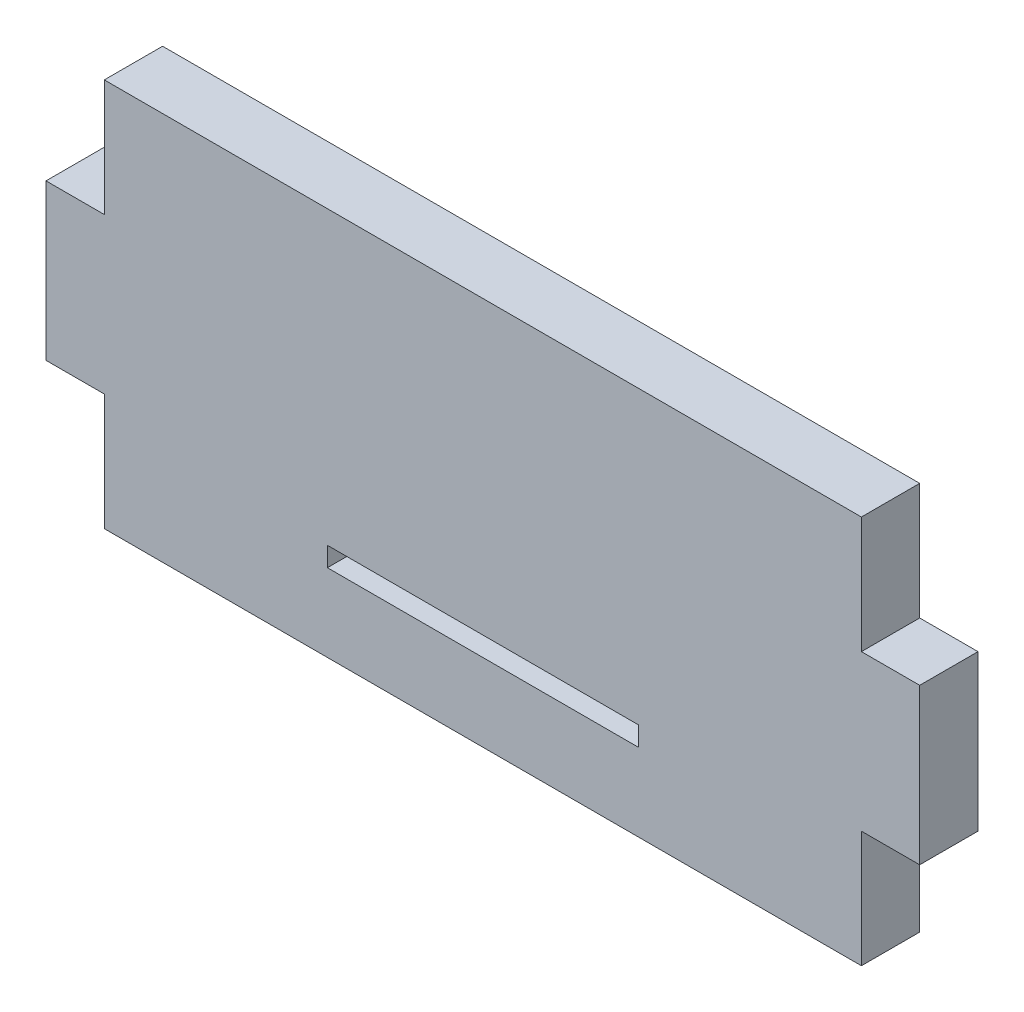
ISO-10303-21;
HEADER;
FILE_DESCRIPTION(('STEP AP214'),'2;1');
FILE_NAME('part.step','',(''),(''),'','','');
FILE_SCHEMA(('AUTOMOTIVE_DESIGN { 1 0 10303 214 1 1 1 1 }'));
ENDSEC;
DATA;
#1=APPLICATION_CONTEXT('core data for automotive mechanical design processes');
#2=APPLICATION_PROTOCOL_DEFINITION('international standard','automotive_design',2000,#1);
#3=PRODUCT_CONTEXT('',#1,'mechanical');
#4=PRODUCT('Part','Part','',(#3));
#5=PRODUCT_RELATED_PRODUCT_CATEGORY('part','',(#4));
#6=PRODUCT_DEFINITION_FORMATION('','',#4);
#7=PRODUCT_DEFINITION_CONTEXT('part definition',#1,'design');
#8=PRODUCT_DEFINITION('design','',#6,#7);
#9=PRODUCT_DEFINITION_SHAPE('','',#8);
#10=(LENGTH_UNIT() NAMED_UNIT(*) SI_UNIT(.MILLI.,.METRE.));
#11=(NAMED_UNIT(*) PLANE_ANGLE_UNIT() SI_UNIT($,.RADIAN.));
#12=(NAMED_UNIT(*) SI_UNIT($,.STERADIAN.) SOLID_ANGLE_UNIT());
#13=UNCERTAINTY_MEASURE_WITH_UNIT(LENGTH_MEASURE(1.E-05),#10,'distance_accuracy_value','');
#14=(GEOMETRIC_REPRESENTATION_CONTEXT(3) GLOBAL_UNCERTAINTY_ASSIGNED_CONTEXT((#13)) GLOBAL_UNIT_ASSIGNED_CONTEXT((#10,
#11,#12)) REPRESENTATION_CONTEXT('',''));
#15=CARTESIAN_POINT('',(0.,0.,0.));
#16=DIRECTION('',(0.,0.,1.));
#17=DIRECTION('',(1.,0.,0.));
#18=AXIS2_PLACEMENT_3D('',#15,#16,#17);
#19=CARTESIAN_POINT('',(0.,0.,9.525));
#20=DIRECTION('',(0.,0.,1.));
#21=DIRECTION('',(1.,0.,0.));
#22=AXIS2_PLACEMENT_3D('',#19,#20,#21);
#23=PLANE('',#22);
#24=DIRECTION('',(0.,-1.,0.));
#25=VECTOR('',#24,1.);
#26=CARTESIAN_POINT('',(0.,0.,9.525));
#27=LINE('',#26,#25);
#28=CARTESIAN_POINT('',(0.,19.05,9.525));
#29=VERTEX_POINT('',#28);
#30=CARTESIAN_POINT('',(0.,0.,9.525));
#31=VERTEX_POINT('',#30);
#32=EDGE_CURVE('E201',#29,#31,#27,.T.);
#33=ORIENTED_EDGE('',*,*,#32,.T.);
#34=DIRECTION('',(1.,0.,0.));
#35=VECTOR('',#34,1.);
#36=CARTESIAN_POINT('',(0.,0.,9.525));
#37=LINE('',#36,#35);
#38=CARTESIAN_POINT('',(123.698,0.,9.525));
#39=VERTEX_POINT('',#38);
#40=EDGE_CURVE('E205',#31,#39,#37,.T.);
#41=ORIENTED_EDGE('',*,*,#40,.T.);
#42=DIRECTION('',(0.,1.,0.));
#43=VECTOR('',#42,1.);
#44=CARTESIAN_POINT('',(123.698,0.,9.525));
#45=LINE('',#44,#43);
#46=CARTESIAN_POINT('',(123.698,19.05,9.525));
#47=VERTEX_POINT('',#46);
#48=EDGE_CURVE('E209',#39,#47,#45,.T.);
#49=ORIENTED_EDGE('',*,*,#48,.T.);
#50=DIRECTION('',(1.,0.,0.));
#51=VECTOR('',#50,1.);
#52=CARTESIAN_POINT('',(123.698,19.05,9.525));
#53=LINE('',#52,#51);
#54=CARTESIAN_POINT('',(133.223,19.05,9.525));
#55=VERTEX_POINT('',#54);
#56=EDGE_CURVE('E212',#47,#55,#53,.T.);
#57=ORIENTED_EDGE('',*,*,#56,.T.);
#58=DIRECTION('',(0.,1.,0.));
#59=VECTOR('',#58,1.);
#60=CARTESIAN_POINT('',(133.223,19.05,9.525));
#61=LINE('',#60,#59);
#62=CARTESIAN_POINT('',(133.223,44.45,9.525));
#63=VERTEX_POINT('',#62);
#64=EDGE_CURVE('E215',#55,#63,#61,.T.);
#65=ORIENTED_EDGE('',*,*,#64,.T.);
#66=DIRECTION('',(-1.,0.,0.));
#67=VECTOR('',#66,1.);
#68=CARTESIAN_POINT('',(123.698,44.45,9.525));
#69=LINE('',#68,#67);
#70=CARTESIAN_POINT('',(123.698,44.45,9.525));
#71=VERTEX_POINT('',#70);
#72=EDGE_CURVE('E218',#63,#71,#69,.T.);
#73=ORIENTED_EDGE('',*,*,#72,.T.);
#74=DIRECTION('',(0.,1.,0.));
#75=VECTOR('',#74,1.);
#76=CARTESIAN_POINT('',(123.698,44.45,9.525));
#77=LINE('',#76,#75);
#78=CARTESIAN_POINT('',(123.698,63.5,9.525));
#79=VERTEX_POINT('',#78);
#80=EDGE_CURVE('E221',#71,#79,#77,.T.);
#81=ORIENTED_EDGE('',*,*,#80,.T.);
#82=DIRECTION('',(-1.,0.,0.));
#83=VECTOR('',#82,1.);
#84=CARTESIAN_POINT('',(0.,63.5,9.525));
#85=LINE('',#84,#83);
#86=CARTESIAN_POINT('',(0.,63.5,9.525));
#87=VERTEX_POINT('',#86);
#88=EDGE_CURVE('E224',#79,#87,#85,.T.);
#89=ORIENTED_EDGE('',*,*,#88,.T.);
#90=DIRECTION('',(0.,-1.,0.));
#91=VECTOR('',#90,1.);
#92=CARTESIAN_POINT('',(0.,44.45,9.525));
#93=LINE('',#92,#91);
#94=CARTESIAN_POINT('',(0.,44.45,9.525));
#95=VERTEX_POINT('',#94);
#96=EDGE_CURVE('E227',#87,#95,#93,.T.);
#97=ORIENTED_EDGE('',*,*,#96,.T.);
#98=DIRECTION('',(-1.,0.,0.));
#99=VECTOR('',#98,1.);
#100=CARTESIAN_POINT('',(0.,44.45,9.525));
#101=LINE('',#100,#99);
#102=CARTESIAN_POINT('',(-9.525,44.45,9.525));
#103=VERTEX_POINT('',#102);
#104=EDGE_CURVE('E230',#95,#103,#101,.T.);
#105=ORIENTED_EDGE('',*,*,#104,.T.);
#106=DIRECTION('',(0.,-1.,0.));
#107=VECTOR('',#106,1.);
#108=CARTESIAN_POINT('',(-9.525,19.05,9.525));
#109=LINE('',#108,#107);
#110=CARTESIAN_POINT('',(-9.525,19.05,9.525));
#111=VERTEX_POINT('',#110);
#112=EDGE_CURVE('E233',#103,#111,#109,.T.);
#113=ORIENTED_EDGE('',*,*,#112,.T.);
#114=DIRECTION('',(1.,0.,0.));
#115=VECTOR('',#114,1.);
#116=CARTESIAN_POINT('',(0.,19.05,9.525));
#117=LINE('',#116,#115);
#118=EDGE_CURVE('E236',#111,#29,#117,.T.);
#119=ORIENTED_EDGE('',*,*,#118,.T.);
#120=EDGE_LOOP('',(#33,#41,#49,#57,#65,#73,#81,#89,#97,#105,#113,#119));
#121=FACE_BOUND('',#120,.T.);
#122=DIRECTION('',(-1.,0.,0.));
#123=VECTOR('',#122,1.);
#124=CARTESIAN_POINT('',(87.249,15.875,9.525));
#125=LINE('',#124,#123);
#126=CARTESIAN_POINT('',(87.249,15.875,9.525));
#127=VERTEX_POINT('',#126);
#128=CARTESIAN_POINT('',(36.449,15.875,9.525));
#129=VERTEX_POINT('',#128);
#130=EDGE_CURVE('E162',#127,#129,#125,.T.);
#131=ORIENTED_EDGE('',*,*,#130,.F.);
#132=DIRECTION('',(0.,1.,0.));
#133=VECTOR('',#132,1.);
#134=CARTESIAN_POINT('',(87.249,12.7,9.525));
#135=LINE('',#134,#133);
#136=CARTESIAN_POINT('',(87.249,12.7,9.525));
#137=VERTEX_POINT('',#136);
#138=EDGE_CURVE('E153',#137,#127,#135,.T.);
#139=ORIENTED_EDGE('',*,*,#138,.F.);
#140=DIRECTION('',(1.,0.,0.));
#141=VECTOR('',#140,1.);
#142=CARTESIAN_POINT('',(87.249,12.7,9.525));
#143=LINE('',#142,#141);
#144=CARTESIAN_POINT('',(36.449,12.7,9.525));
#145=VERTEX_POINT('',#144);
#146=EDGE_CURVE('E179',#145,#137,#143,.T.);
#147=ORIENTED_EDGE('',*,*,#146,.F.);
#148=DIRECTION('',(0.,-1.,0.));
#149=VECTOR('',#148,1.);
#150=CARTESIAN_POINT('',(36.449,12.7,9.525));
#151=LINE('',#150,#149);
#152=EDGE_CURVE('E175',#129,#145,#151,.T.);
#153=ORIENTED_EDGE('',*,*,#152,.F.);
#154=EDGE_LOOP('',(#131,#139,#147,#153));
#155=FACE_BOUND('',#154,.T.);
#156=ADVANCED_FACE('F39',(#121,#155),#23,.T.);
#157=CARTESIAN_POINT('',(0.,0.,0.));
#158=DIRECTION('',(0.,0.,1.));
#159=DIRECTION('',(1.,0.,0.));
#160=AXIS2_PLACEMENT_3D('',#157,#158,#159);
#161=PLANE('',#160);
#162=DIRECTION('',(0.,-1.,0.));
#163=VECTOR('',#162,1.);
#164=CARTESIAN_POINT('',(0.,0.,0.));
#165=LINE('',#164,#163);
#166=CARTESIAN_POINT('',(0.,19.05,0.));
#167=VERTEX_POINT('',#166);
#168=CARTESIAN_POINT('',(0.,0.,0.));
#169=VERTEX_POINT('',#168);
#170=EDGE_CURVE('E171',#167,#169,#165,.T.);
#171=ORIENTED_EDGE('',*,*,#170,.F.);
#172=DIRECTION('',(1.,0.,0.));
#173=VECTOR('',#172,1.);
#174=CARTESIAN_POINT('',(0.,19.05,0.));
#175=LINE('',#174,#173);
#176=CARTESIAN_POINT('',(-9.525,19.05,0.));
#177=VERTEX_POINT('',#176);
#178=EDGE_CURVE('E206',#177,#167,#175,.T.);
#179=ORIENTED_EDGE('',*,*,#178,.F.);
#180=DIRECTION('',(0.,-1.,0.));
#181=VECTOR('',#180,1.);
#182=CARTESIAN_POINT('',(-9.525,19.05,0.));
#183=LINE('',#182,#181);
#184=CARTESIAN_POINT('',(-9.525,44.45,0.));
#185=VERTEX_POINT('',#184);
#186=EDGE_CURVE('E270',#185,#177,#183,.T.);
#187=ORIENTED_EDGE('',*,*,#186,.F.);
#188=DIRECTION('',(-1.,0.,0.));
#189=VECTOR('',#188,1.);
#190=CARTESIAN_POINT('',(0.,44.45,0.));
#191=LINE('',#190,#189);
#192=CARTESIAN_POINT('',(0.,44.45,0.));
#193=VERTEX_POINT('',#192);
#194=EDGE_CURVE('E267',#193,#185,#191,.T.);
#195=ORIENTED_EDGE('',*,*,#194,.F.);
#196=DIRECTION('',(0.,-1.,0.));
#197=VECTOR('',#196,1.);
#198=CARTESIAN_POINT('',(0.,44.45,0.));
#199=LINE('',#198,#197);
#200=CARTESIAN_POINT('',(0.,63.5,0.));
#201=VERTEX_POINT('',#200);
#202=EDGE_CURVE('E264',#201,#193,#199,.T.);
#203=ORIENTED_EDGE('',*,*,#202,.F.);
#204=DIRECTION('',(-1.,0.,0.));
#205=VECTOR('',#204,1.);
#206=CARTESIAN_POINT('',(0.,63.5,0.));
#207=LINE('',#206,#205);
#208=CARTESIAN_POINT('',(123.698,63.5,0.));
#209=VERTEX_POINT('',#208);
#210=EDGE_CURVE('E261',#209,#201,#207,.T.);
#211=ORIENTED_EDGE('',*,*,#210,.F.);
#212=DIRECTION('',(0.,1.,0.));
#213=VECTOR('',#212,1.);
#214=CARTESIAN_POINT('',(123.698,44.45,0.));
#215=LINE('',#214,#213);
#216=CARTESIAN_POINT('',(123.698,44.45,0.));
#217=VERTEX_POINT('',#216);
#218=EDGE_CURVE('E258',#217,#209,#215,.T.);
#219=ORIENTED_EDGE('',*,*,#218,.F.);
#220=DIRECTION('',(-1.,0.,0.));
#221=VECTOR('',#220,1.);
#222=CARTESIAN_POINT('',(123.698,44.45,0.));
#223=LINE('',#222,#221);
#224=CARTESIAN_POINT('',(133.223,44.45,0.));
#225=VERTEX_POINT('',#224);
#226=EDGE_CURVE('E255',#225,#217,#223,.T.);
#227=ORIENTED_EDGE('',*,*,#226,.F.);
#228=DIRECTION('',(0.,1.,0.));
#229=VECTOR('',#228,1.);
#230=CARTESIAN_POINT('',(133.223,19.05,0.));
#231=LINE('',#230,#229);
#232=CARTESIAN_POINT('',(133.223,19.05,0.));
#233=VERTEX_POINT('',#232);
#234=EDGE_CURVE('E252',#233,#225,#231,.T.);
#235=ORIENTED_EDGE('',*,*,#234,.F.);
#236=DIRECTION('',(1.,0.,0.));
#237=VECTOR('',#236,1.);
#238=CARTESIAN_POINT('',(123.698,19.05,0.));
#239=LINE('',#238,#237);
#240=CARTESIAN_POINT('',(123.698,19.05,0.));
#241=VERTEX_POINT('',#240);
#242=EDGE_CURVE('E249',#241,#233,#239,.T.);
#243=ORIENTED_EDGE('',*,*,#242,.F.);
#244=DIRECTION('',(0.,1.,0.));
#245=VECTOR('',#244,1.);
#246=CARTESIAN_POINT('',(123.698,0.,0.));
#247=LINE('',#246,#245);
#248=CARTESIAN_POINT('',(123.698,0.,0.));
#249=VERTEX_POINT('',#248);
#250=EDGE_CURVE('E246',#249,#241,#247,.T.);
#251=ORIENTED_EDGE('',*,*,#250,.F.);
#252=DIRECTION('',(1.,0.,0.));
#253=VECTOR('',#252,1.);
#254=CARTESIAN_POINT('',(86.7684631829553,0.,0.));
#255=LINE('',#254,#253);
#256=EDGE_CURVE('E243',#169,#249,#255,.T.);
#257=ORIENTED_EDGE('',*,*,#256,.F.);
#258=EDGE_LOOP('',(#171,#179,#187,#195,#203,#211,#219,#227,#235,#243,#251,#257));
#259=FACE_BOUND('',#258,.T.);
#260=DIRECTION('',(0.,1.,0.));
#261=VECTOR('',#260,1.);
#262=CARTESIAN_POINT('',(87.249,12.7,0.));
#263=LINE('',#262,#261);
#264=CARTESIAN_POINT('',(87.249,12.7,0.));
#265=VERTEX_POINT('',#264);
#266=CARTESIAN_POINT('',(87.249,15.875,0.));
#267=VERTEX_POINT('',#266);
#268=EDGE_CURVE('E63',#265,#267,#263,.T.);
#269=ORIENTED_EDGE('',*,*,#268,.T.);
#270=DIRECTION('',(-1.,0.,0.));
#271=VECTOR('',#270,1.);
#272=CARTESIAN_POINT('',(87.249,15.875,0.));
#273=LINE('',#272,#271);
#274=CARTESIAN_POINT('',(36.449,15.875,0.));
#275=VERTEX_POINT('',#274);
#276=EDGE_CURVE('E169',#267,#275,#273,.T.);
#277=ORIENTED_EDGE('',*,*,#276,.T.);
#278=DIRECTION('',(0.,-1.,0.));
#279=VECTOR('',#278,1.);
#280=CARTESIAN_POINT('',(36.449,12.7,0.));
#281=LINE('',#280,#279);
#282=CARTESIAN_POINT('',(36.449,12.7,0.));
#283=VERTEX_POINT('',#282);
#284=EDGE_CURVE('E188',#275,#283,#281,.T.);
#285=ORIENTED_EDGE('',*,*,#284,.T.);
#286=DIRECTION('',(1.,0.,0.));
#287=VECTOR('',#286,1.);
#288=CARTESIAN_POINT('',(87.249,12.7,0.));
#289=LINE('',#288,#287);
#290=EDGE_CURVE('E163',#283,#265,#289,.T.);
#291=ORIENTED_EDGE('',*,*,#290,.T.);
#292=EDGE_LOOP('',(#269,#277,#285,#291));
#293=FACE_BOUND('',#292,.T.);
#294=ADVANCED_FACE('F325',(#259,#293),#161,.F.);
#295=CARTESIAN_POINT('',(0.,0.,9.525));
#296=DIRECTION('',(1.,0.,0.));
#297=DIRECTION('',(0.,0.,-1.));
#298=AXIS2_PLACEMENT_3D('',#295,#296,#297);
#299=PLANE('',#298);
#300=ORIENTED_EDGE('',*,*,#170,.T.);
#301=DIRECTION('',(0.,0.,-1.));
#302=VECTOR('',#301,1.);
#303=CARTESIAN_POINT('',(0.,0.,9.525));
#304=LINE('',#303,#302);
#305=EDGE_CURVE('E11',#31,#169,#304,.T.);
#306=ORIENTED_EDGE('',*,*,#305,.F.);
#307=ORIENTED_EDGE('',*,*,#32,.F.);
#308=DIRECTION('',(0.,0.,-1.));
#309=VECTOR('',#308,1.);
#310=CARTESIAN_POINT('',(0.,19.05,9.525));
#311=LINE('',#310,#309);
#312=EDGE_CURVE('E239',#29,#167,#311,.T.);
#313=ORIENTED_EDGE('',*,*,#312,.T.);
#314=EDGE_LOOP('',(#300,#306,#307,#313));
#315=FACE_BOUND('',#314,.T.);
#316=ADVANCED_FACE('F41',(#315),#299,.F.);
#317=CARTESIAN_POINT('',(86.7684631829553,0.,9.525));
#318=DIRECTION('',(0.,1.,0.));
#319=DIRECTION('',(0.,0.,1.));
#320=AXIS2_PLACEMENT_3D('',#317,#318,#319);
#321=PLANE('',#320);
#322=ORIENTED_EDGE('',*,*,#256,.T.);
#323=DIRECTION('',(0.,0.,-1.));
#324=VECTOR('',#323,1.);
#325=CARTESIAN_POINT('',(123.698,0.,9.525));
#326=LINE('',#325,#324);
#327=EDGE_CURVE('E48',#39,#249,#326,.T.);
#328=ORIENTED_EDGE('',*,*,#327,.F.);
#329=ORIENTED_EDGE('',*,*,#40,.F.);
#330=ORIENTED_EDGE('',*,*,#305,.T.);
#331=EDGE_LOOP('',(#322,#328,#329,#330));
#332=FACE_BOUND('',#331,.T.);
#333=ADVANCED_FACE('F342',(#332),#321,.F.);
#334=CARTESIAN_POINT('',(123.698,0.,9.525));
#335=DIRECTION('',(-1.,0.,0.));
#336=DIRECTION('',(0.,0.,1.));
#337=AXIS2_PLACEMENT_3D('',#334,#335,#336);
#338=PLANE('',#337);
#339=ORIENTED_EDGE('',*,*,#250,.T.);
#340=DIRECTION('',(0.,0.,-1.));
#341=VECTOR('',#340,1.);
#342=CARTESIAN_POINT('',(123.698,19.05,9.525));
#343=LINE('',#342,#341);
#344=EDGE_CURVE('E310',#47,#241,#343,.T.);
#345=ORIENTED_EDGE('',*,*,#344,.F.);
#346=ORIENTED_EDGE('',*,*,#48,.F.);
#347=ORIENTED_EDGE('',*,*,#327,.T.);
#348=EDGE_LOOP('',(#339,#345,#346,#347));
#349=FACE_BOUND('',#348,.T.);
#350=ADVANCED_FACE('F319',(#349),#338,.F.);
#351=CARTESIAN_POINT('',(123.698,19.05,9.525));
#352=DIRECTION('',(0.,1.,0.));
#353=DIRECTION('',(0.,0.,1.));
#354=AXIS2_PLACEMENT_3D('',#351,#352,#353);
#355=PLANE('',#354);
#356=ORIENTED_EDGE('',*,*,#242,.T.);
#357=DIRECTION('',(0.,0.,-1.));
#358=VECTOR('',#357,1.);
#359=CARTESIAN_POINT('',(133.223,19.05,9.525));
#360=LINE('',#359,#358);
#361=EDGE_CURVE('E306',#55,#233,#360,.T.);
#362=ORIENTED_EDGE('',*,*,#361,.F.);
#363=ORIENTED_EDGE('',*,*,#56,.F.);
#364=ORIENTED_EDGE('',*,*,#344,.T.);
#365=EDGE_LOOP('',(#356,#362,#363,#364));
#366=FACE_BOUND('',#365,.T.);
#367=ADVANCED_FACE('F331',(#366),#355,.F.);
#368=CARTESIAN_POINT('',(133.223,19.05,9.525));
#369=DIRECTION('',(-1.,0.,0.));
#370=DIRECTION('',(0.,0.,1.));
#371=AXIS2_PLACEMENT_3D('',#368,#369,#370);
#372=PLANE('',#371);
#373=ORIENTED_EDGE('',*,*,#234,.T.);
#374=DIRECTION('',(0.,0.,-1.));
#375=VECTOR('',#374,1.);
#376=CARTESIAN_POINT('',(133.223,44.45,9.525));
#377=LINE('',#376,#375);
#378=EDGE_CURVE('E302',#63,#225,#377,.T.);
#379=ORIENTED_EDGE('',*,*,#378,.F.);
#380=ORIENTED_EDGE('',*,*,#64,.F.);
#381=ORIENTED_EDGE('',*,*,#361,.T.);
#382=EDGE_LOOP('',(#373,#379,#380,#381));
#383=FACE_BOUND('',#382,.T.);
#384=ADVANCED_FACE('F335',(#383),#372,.F.);
#385=CARTESIAN_POINT('',(123.698,44.45,9.525));
#386=DIRECTION('',(0.,-1.,0.));
#387=DIRECTION('',(1.,0.,0.));
#388=AXIS2_PLACEMENT_3D('',#385,#386,#387);
#389=PLANE('',#388);
#390=ORIENTED_EDGE('',*,*,#226,.T.);
#391=DIRECTION('',(0.,0.,-1.));
#392=VECTOR('',#391,1.);
#393=CARTESIAN_POINT('',(123.698,44.45,9.525));
#394=LINE('',#393,#392);
#395=EDGE_CURVE('E298',#71,#217,#394,.T.);
#396=ORIENTED_EDGE('',*,*,#395,.F.);
#397=ORIENTED_EDGE('',*,*,#72,.F.);
#398=ORIENTED_EDGE('',*,*,#378,.T.);
#399=EDGE_LOOP('',(#390,#396,#397,#398));
#400=FACE_BOUND('',#399,.T.);
#401=ADVANCED_FACE('F375',(#400),#389,.F.);
#402=CARTESIAN_POINT('',(123.698,44.45,9.525));
#403=DIRECTION('',(-1.,0.,0.));
#404=DIRECTION('',(0.,0.,1.));
#405=AXIS2_PLACEMENT_3D('',#402,#403,#404);
#406=PLANE('',#405);
#407=ORIENTED_EDGE('',*,*,#218,.T.);
#408=DIRECTION('',(0.,0.,-1.));
#409=VECTOR('',#408,1.);
#410=CARTESIAN_POINT('',(123.698,63.5,9.525));
#411=LINE('',#410,#409);
#412=EDGE_CURVE('E294',#79,#209,#411,.T.);
#413=ORIENTED_EDGE('',*,*,#412,.F.);
#414=ORIENTED_EDGE('',*,*,#80,.F.);
#415=ORIENTED_EDGE('',*,*,#395,.T.);
#416=EDGE_LOOP('',(#407,#413,#414,#415));
#417=FACE_BOUND('',#416,.T.);
#418=ADVANCED_FACE('F373',(#417),#406,.F.);
#419=CARTESIAN_POINT('',(0.,63.5,9.525));
#420=DIRECTION('',(0.,-1.,0.));
#421=DIRECTION('',(0.,0.,-1.));
#422=AXIS2_PLACEMENT_3D('',#419,#420,#421);
#423=PLANE('',#422);
#424=ORIENTED_EDGE('',*,*,#210,.T.);
#425=DIRECTION('',(0.,0.,-1.));
#426=VECTOR('',#425,1.);
#427=CARTESIAN_POINT('',(0.,63.5,9.525));
#428=LINE('',#427,#426);
#429=EDGE_CURVE('E290',#87,#201,#428,.T.);
#430=ORIENTED_EDGE('',*,*,#429,.F.);
#431=ORIENTED_EDGE('',*,*,#88,.F.);
#432=ORIENTED_EDGE('',*,*,#412,.T.);
#433=EDGE_LOOP('',(#424,#430,#431,#432));
#434=FACE_BOUND('',#433,.T.);
#435=ADVANCED_FACE('F369',(#434),#423,.F.);
#436=CARTESIAN_POINT('',(0.,44.45,9.525));
#437=DIRECTION('',(1.,0.,0.));
#438=DIRECTION('',(0.,1.,0.));
#439=AXIS2_PLACEMENT_3D('',#436,#437,#438);
#440=PLANE('',#439);
#441=ORIENTED_EDGE('',*,*,#202,.T.);
#442=DIRECTION('',(0.,0.,-1.));
#443=VECTOR('',#442,1.);
#444=CARTESIAN_POINT('',(0.,44.45,9.525));
#445=LINE('',#444,#443);
#446=EDGE_CURVE('E286',#95,#193,#445,.T.);
#447=ORIENTED_EDGE('',*,*,#446,.F.);
#448=ORIENTED_EDGE('',*,*,#96,.F.);
#449=ORIENTED_EDGE('',*,*,#429,.T.);
#450=EDGE_LOOP('',(#441,#447,#448,#449));
#451=FACE_BOUND('',#450,.T.);
#452=ADVANCED_FACE('F364',(#451),#440,.F.);
#453=CARTESIAN_POINT('',(0.,44.45,9.525));
#454=DIRECTION('',(0.,-1.,0.));
#455=DIRECTION('',(1.,0.,0.));
#456=AXIS2_PLACEMENT_3D('',#453,#454,#455);
#457=PLANE('',#456);
#458=ORIENTED_EDGE('',*,*,#194,.T.);
#459=DIRECTION('',(0.,0.,-1.));
#460=VECTOR('',#459,1.);
#461=CARTESIAN_POINT('',(-9.525,44.45,9.525));
#462=LINE('',#461,#460);
#463=EDGE_CURVE('E282',#103,#185,#462,.T.);
#464=ORIENTED_EDGE('',*,*,#463,.F.);
#465=ORIENTED_EDGE('',*,*,#104,.F.);
#466=ORIENTED_EDGE('',*,*,#446,.T.);
#467=EDGE_LOOP('',(#458,#464,#465,#466));
#468=FACE_BOUND('',#467,.T.);
#469=ADVANCED_FACE('F358',(#468),#457,.F.);
#470=CARTESIAN_POINT('',(-9.525,19.05,9.525));
#471=DIRECTION('',(1.,0.,0.));
#472=DIRECTION('',(0.,0.,-1.));
#473=AXIS2_PLACEMENT_3D('',#470,#471,#472);
#474=PLANE('',#473);
#475=ORIENTED_EDGE('',*,*,#186,.T.);
#476=DIRECTION('',(0.,0.,-1.));
#477=VECTOR('',#476,1.);
#478=CARTESIAN_POINT('',(-9.525,19.05,9.525));
#479=LINE('',#478,#477);
#480=EDGE_CURVE('E278',#111,#177,#479,.T.);
#481=ORIENTED_EDGE('',*,*,#480,.F.);
#482=ORIENTED_EDGE('',*,*,#112,.F.);
#483=ORIENTED_EDGE('',*,*,#463,.T.);
#484=EDGE_LOOP('',(#475,#481,#482,#483));
#485=FACE_BOUND('',#484,.T.);
#486=ADVANCED_FACE('F354',(#485),#474,.F.);
#487=CARTESIAN_POINT('',(0.,19.05,9.525));
#488=DIRECTION('',(0.,1.,0.));
#489=DIRECTION('',(0.,0.,1.));
#490=AXIS2_PLACEMENT_3D('',#487,#488,#489);
#491=PLANE('',#490);
#492=ORIENTED_EDGE('',*,*,#178,.T.);
#493=ORIENTED_EDGE('',*,*,#312,.F.);
#494=ORIENTED_EDGE('',*,*,#118,.F.);
#495=ORIENTED_EDGE('',*,*,#480,.T.);
#496=EDGE_LOOP('',(#492,#493,#494,#495));
#497=FACE_BOUND('',#496,.T.);
#498=ADVANCED_FACE('F349',(#497),#491,.F.);
#499=CARTESIAN_POINT('',(87.249,12.7,9.525));
#500=DIRECTION('',(-1.,0.,0.));
#501=DIRECTION('',(0.,0.,1.));
#502=AXIS2_PLACEMENT_3D('',#499,#500,#501);
#503=PLANE('',#502);
#504=ORIENTED_EDGE('',*,*,#268,.F.);
#505=DIRECTION('',(0.,0.,-1.));
#506=VECTOR('',#505,1.);
#507=CARTESIAN_POINT('',(87.249,12.7,9.525));
#508=LINE('',#507,#506);
#509=EDGE_CURVE('E157',#137,#265,#508,.T.);
#510=ORIENTED_EDGE('',*,*,#509,.F.);
#511=ORIENTED_EDGE('',*,*,#138,.T.);
#512=DIRECTION('',(0.,0.,-1.));
#513=VECTOR('',#512,1.);
#514=CARTESIAN_POINT('',(87.249,15.875,9.525));
#515=LINE('',#514,#513);
#516=EDGE_CURVE('E156',#127,#267,#515,.T.);
#517=ORIENTED_EDGE('',*,*,#516,.T.);
#518=EDGE_LOOP('',(#504,#510,#511,#517));
#519=FACE_BOUND('',#518,.T.);
#520=ADVANCED_FACE('F155',(#519),#503,.T.);
#521=CARTESIAN_POINT('',(87.249,15.875,9.525));
#522=DIRECTION('',(0.,-1.,0.));
#523=DIRECTION('',(0.,0.,-1.));
#524=AXIS2_PLACEMENT_3D('',#521,#522,#523);
#525=PLANE('',#524);
#526=ORIENTED_EDGE('',*,*,#276,.F.);
#527=ORIENTED_EDGE('',*,*,#516,.F.);
#528=ORIENTED_EDGE('',*,*,#130,.T.);
#529=DIRECTION('',(0.,0.,-1.));
#530=VECTOR('',#529,1.);
#531=CARTESIAN_POINT('',(36.449,15.875,9.525));
#532=LINE('',#531,#530);
#533=EDGE_CURVE('E172',#129,#275,#532,.T.);
#534=ORIENTED_EDGE('',*,*,#533,.T.);
#535=EDGE_LOOP('',(#526,#527,#528,#534));
#536=FACE_BOUND('',#535,.T.);
#537=ADVANCED_FACE('F166',(#536),#525,.T.);
#538=CARTESIAN_POINT('',(36.449,12.7,9.525));
#539=DIRECTION('',(1.,0.,0.));
#540=DIRECTION('',(0.,1.,0.));
#541=AXIS2_PLACEMENT_3D('',#538,#539,#540);
#542=PLANE('',#541);
#543=ORIENTED_EDGE('',*,*,#284,.F.);
#544=ORIENTED_EDGE('',*,*,#533,.F.);
#545=ORIENTED_EDGE('',*,*,#152,.T.);
#546=DIRECTION('',(0.,0.,-1.));
#547=VECTOR('',#546,1.);
#548=CARTESIAN_POINT('',(36.449,12.7,9.525));
#549=LINE('',#548,#547);
#550=EDGE_CURVE('E55',#145,#283,#549,.T.);
#551=ORIENTED_EDGE('',*,*,#550,.T.);
#552=EDGE_LOOP('',(#543,#544,#545,#551));
#553=FACE_BOUND('',#552,.T.);
#554=ADVANCED_FACE('F433',(#553),#542,.T.);
#555=CARTESIAN_POINT('',(87.249,12.7,9.525));
#556=DIRECTION('',(0.,1.,0.));
#557=DIRECTION('',(0.,0.,1.));
#558=AXIS2_PLACEMENT_3D('',#555,#556,#557);
#559=PLANE('',#558);
#560=ORIENTED_EDGE('',*,*,#290,.F.);
#561=ORIENTED_EDGE('',*,*,#550,.F.);
#562=ORIENTED_EDGE('',*,*,#146,.T.);
#563=ORIENTED_EDGE('',*,*,#509,.T.);
#564=EDGE_LOOP('',(#560,#561,#562,#563));
#565=FACE_BOUND('',#564,.T.);
#566=ADVANCED_FACE('F439',(#565),#559,.T.);
#567=CLOSED_SHELL('',(#156,#294,#316,#333,#350,#367,#384,#401,#418,#435,#452,#469,#486,#498,
#520,#537,#554,#566));
#568=MANIFOLD_SOLID_BREP('B2',#567);
#569=ADVANCED_BREP_SHAPE_REPRESENTATION('',(#18,#568),#14);
#570=SHAPE_DEFINITION_REPRESENTATION(#9,#569);
ENDSEC;
END-ISO-10303-21;
